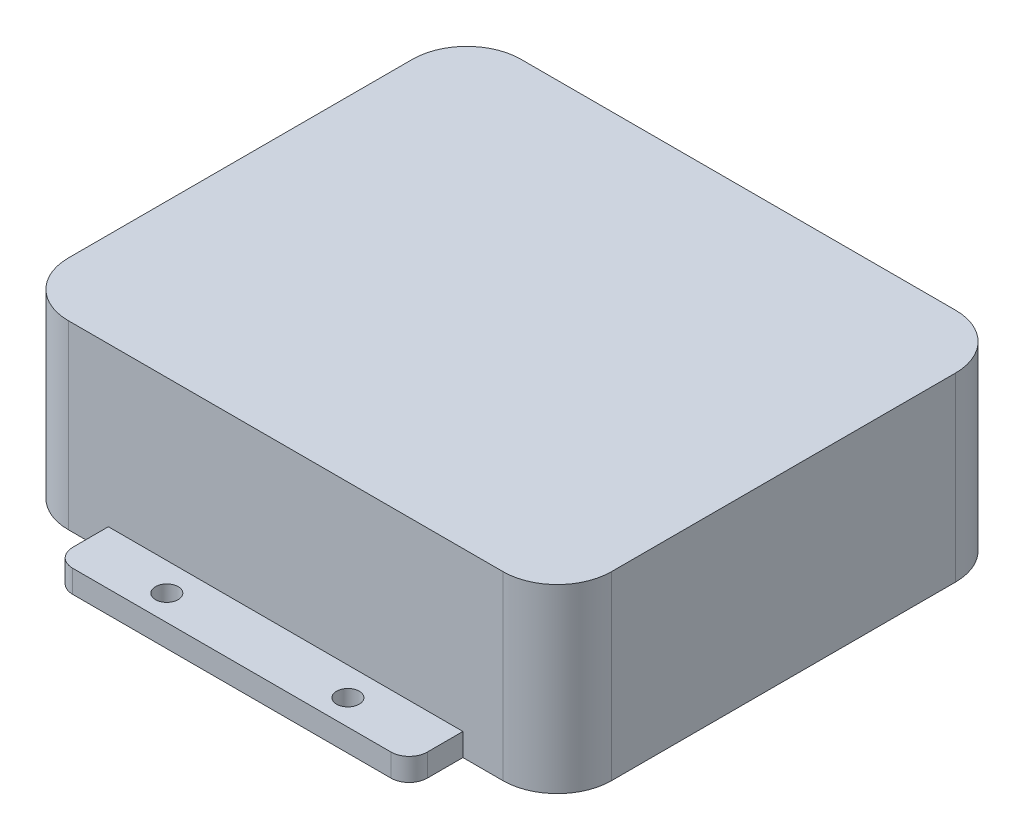
ISO-10303-21;
HEADER;
FILE_DESCRIPTION(('STEP AP214'),'2;1');
FILE_NAME('part.step','',(''),(''),'','','');
FILE_SCHEMA(('AUTOMOTIVE_DESIGN { 1 0 10303 214 1 1 1 1 }'));
ENDSEC;
DATA;
#1=APPLICATION_CONTEXT('core data for automotive mechanical design processes');
#2=APPLICATION_PROTOCOL_DEFINITION('international standard','automotive_design',2000,#1);
#3=PRODUCT_CONTEXT('',#1,'mechanical');
#4=PRODUCT('Part','Part','',(#3));
#5=PRODUCT_RELATED_PRODUCT_CATEGORY('part','',(#4));
#6=PRODUCT_DEFINITION_FORMATION('','',#4);
#7=PRODUCT_DEFINITION_CONTEXT('part definition',#1,'design');
#8=PRODUCT_DEFINITION('design','',#6,#7);
#9=PRODUCT_DEFINITION_SHAPE('','',#8);
#10=(LENGTH_UNIT() NAMED_UNIT(*) SI_UNIT(.MILLI.,.METRE.));
#11=(NAMED_UNIT(*) PLANE_ANGLE_UNIT() SI_UNIT($,.RADIAN.));
#12=(NAMED_UNIT(*) SI_UNIT($,.STERADIAN.) SOLID_ANGLE_UNIT());
#13=UNCERTAINTY_MEASURE_WITH_UNIT(LENGTH_MEASURE(1.E-05),#10,'distance_accuracy_value','');
#14=(GEOMETRIC_REPRESENTATION_CONTEXT(3) GLOBAL_UNCERTAINTY_ASSIGNED_CONTEXT((#13)) GLOBAL_UNIT_ASSIGNED_CONTEXT((#10,
#11,#12)) REPRESENTATION_CONTEXT('',''));
#15=CARTESIAN_POINT('',(0.,0.,0.));
#16=DIRECTION('',(0.,0.,1.));
#17=DIRECTION('',(1.,0.,0.));
#18=AXIS2_PLACEMENT_3D('',#15,#16,#17);
#19=CARTESIAN_POINT('',(-30.4799999999999,25.4,-31.75));
#20=DIRECTION('',(0.,0.,-1.));
#21=DIRECTION('',(-1.,0.,0.));
#22=AXIS2_PLACEMENT_3D('',#19,#20,#21);
#23=PLANE('',#22);
#24=DIRECTION('',(1.,0.,0.));
#25=VECTOR('',#24,1.);
#26=CARTESIAN_POINT('',(-30.4799999999999,0.,-31.75));
#27=LINE('',#26,#25);
#28=CARTESIAN_POINT('',(24.8694908342602,0.,-31.75));
#29=VERTEX_POINT('',#28);
#30=CARTESIAN_POINT('',(30.48,0.,-31.75));
#31=VERTEX_POINT('',#30);
#32=EDGE_CURVE('E193',#29,#31,#27,.T.);
#33=ORIENTED_EDGE('',*,*,#32,.F.);
#34=DIRECTION('',(0.,-1.,0.));
#35=VECTOR('',#34,1.);
#36=CARTESIAN_POINT('',(24.8694908342602,3.175,-31.75));
#37=LINE('',#36,#35);
#38=CARTESIAN_POINT('',(24.8694908342602,3.175,-31.75));
#39=VERTEX_POINT('',#38);
#40=EDGE_CURVE('E51',#39,#29,#37,.T.);
#41=ORIENTED_EDGE('',*,*,#40,.F.);
#42=DIRECTION('',(1.,0.,0.));
#43=VECTOR('',#42,1.);
#44=CARTESIAN_POINT('',(-24.8694908342602,3.175,-31.75));
#45=LINE('',#44,#43);
#46=CARTESIAN_POINT('',(-24.8694908342602,3.175,-31.75));
#47=VERTEX_POINT('',#46);
#48=EDGE_CURVE('E179',#47,#39,#45,.T.);
#49=ORIENTED_EDGE('',*,*,#48,.F.);
#50=DIRECTION('',(0.,-1.,0.));
#51=VECTOR('',#50,1.);
#52=CARTESIAN_POINT('',(-24.8694908342602,3.175,-31.75));
#53=LINE('',#52,#51);
#54=CARTESIAN_POINT('',(-24.8694908342602,0.,-31.75));
#55=VERTEX_POINT('',#54);
#56=EDGE_CURVE('E338',#47,#55,#53,.T.);
#57=ORIENTED_EDGE('',*,*,#56,.T.);
#58=CARTESIAN_POINT('',(-30.4799999999999,0.,-31.75));
#59=VERTEX_POINT('',#58);
#60=EDGE_CURVE('E281',#59,#55,#27,.T.);
#61=ORIENTED_EDGE('',*,*,#60,.F.);
#62=DIRECTION('',(0.,-1.,0.));
#63=VECTOR('',#62,1.);
#64=CARTESIAN_POINT('',(-30.4799999999999,25.4,-31.75));
#65=LINE('',#64,#63);
#66=CARTESIAN_POINT('',(-30.4799999999999,25.4,-31.75));
#67=VERTEX_POINT('',#66);
#68=EDGE_CURVE('E308',#67,#59,#65,.T.);
#69=ORIENTED_EDGE('',*,*,#68,.F.);
#70=DIRECTION('',(1.,0.,0.));
#71=VECTOR('',#70,1.);
#72=CARTESIAN_POINT('',(-30.4799999999999,25.4,-31.75));
#73=LINE('',#72,#71);
#74=CARTESIAN_POINT('',(30.48,25.4,-31.75));
#75=VERTEX_POINT('',#74);
#76=EDGE_CURVE('E259',#67,#75,#73,.T.);
#77=ORIENTED_EDGE('',*,*,#76,.T.);
#78=DIRECTION('',(0.,-1.,0.));
#79=VECTOR('',#78,1.);
#80=CARTESIAN_POINT('',(30.48,25.4,-31.75));
#81=LINE('',#80,#79);
#82=EDGE_CURVE('E44',#75,#31,#81,.T.);
#83=ORIENTED_EDGE('',*,*,#82,.T.);
#84=EDGE_LOOP('',(#33,#41,#49,#57,#61,#69,#77,#83));
#85=FACE_BOUND('',#84,.T.);
#86=ADVANCED_FACE('F36',(#85),#23,.T.);
#87=CARTESIAN_POINT('',(-30.4799999999999,25.4,31.75));
#88=DIRECTION('',(0.,0.,-1.));
#89=DIRECTION('',(-1.,0.,0.));
#90=AXIS2_PLACEMENT_3D('',#87,#88,#89);
#91=PLANE('',#90);
#92=DIRECTION('',(0.,-1.,0.));
#93=VECTOR('',#92,1.);
#94=CARTESIAN_POINT('',(24.8694908342602,3.175,31.75));
#95=LINE('',#94,#93);
#96=CARTESIAN_POINT('',(24.8694908342602,3.175,31.75));
#97=VERTEX_POINT('',#96);
#98=CARTESIAN_POINT('',(24.8694908342602,0.,31.75));
#99=VERTEX_POINT('',#98);
#100=EDGE_CURVE('E247',#97,#99,#95,.T.);
#101=ORIENTED_EDGE('',*,*,#100,.T.);
#102=DIRECTION('',(1.,0.,0.));
#103=VECTOR('',#102,1.);
#104=CARTESIAN_POINT('',(-30.4799999999999,0.,31.75));
#105=LINE('',#104,#103);
#106=CARTESIAN_POINT('',(30.48,0.,31.75));
#107=VERTEX_POINT('',#106);
#108=EDGE_CURVE('E293',#99,#107,#105,.T.);
#109=ORIENTED_EDGE('',*,*,#108,.T.);
#110=DIRECTION('',(0.,-1.,0.));
#111=VECTOR('',#110,1.);
#112=CARTESIAN_POINT('',(30.48,25.4,31.75));
#113=LINE('',#112,#111);
#114=CARTESIAN_POINT('',(30.48,25.4,31.75));
#115=VERTEX_POINT('',#114);
#116=EDGE_CURVE('E299',#115,#107,#113,.T.);
#117=ORIENTED_EDGE('',*,*,#116,.F.);
#118=DIRECTION('',(1.,0.,0.));
#119=VECTOR('',#118,1.);
#120=CARTESIAN_POINT('',(-30.4799999999999,25.4,31.75));
#121=LINE('',#120,#119);
#122=CARTESIAN_POINT('',(-30.4799999999999,25.4,31.75));
#123=VERTEX_POINT('',#122);
#124=EDGE_CURVE('E271',#123,#115,#121,.T.);
#125=ORIENTED_EDGE('',*,*,#124,.F.);
#126=DIRECTION('',(0.,-1.,0.));
#127=VECTOR('',#126,1.);
#128=CARTESIAN_POINT('',(-30.4799999999999,25.4,31.75));
#129=LINE('',#128,#127);
#130=CARTESIAN_POINT('',(-30.4799999999999,0.,31.75));
#131=VERTEX_POINT('',#130);
#132=EDGE_CURVE('E302',#123,#131,#129,.T.);
#133=ORIENTED_EDGE('',*,*,#132,.T.);
#134=CARTESIAN_POINT('',(-24.8694908342602,0.,31.75));
#135=VERTEX_POINT('',#134);
#136=EDGE_CURVE('E294',#131,#135,#105,.T.);
#137=ORIENTED_EDGE('',*,*,#136,.T.);
#138=DIRECTION('',(0.,-1.,0.));
#139=VECTOR('',#138,1.);
#140=CARTESIAN_POINT('',(-24.8694908342602,3.175,31.75));
#141=LINE('',#140,#139);
#142=CARTESIAN_POINT('',(-24.8694908342602,3.175,31.75));
#143=VERTEX_POINT('',#142);
#144=EDGE_CURVE('E244',#143,#135,#141,.T.);
#145=ORIENTED_EDGE('',*,*,#144,.F.);
#146=DIRECTION('',(-1.,0.,0.));
#147=VECTOR('',#146,1.);
#148=CARTESIAN_POINT('',(-24.8694908342602,3.175,31.75));
#149=LINE('',#148,#147);
#150=EDGE_CURVE('E59',#97,#143,#149,.T.);
#151=ORIENTED_EDGE('',*,*,#150,.F.);
#152=EDGE_LOOP('',(#101,#109,#117,#125,#133,#137,#145,#151));
#153=FACE_BOUND('',#152,.T.);
#154=ADVANCED_FACE('F393',(#153),#91,.F.);
#155=CARTESIAN_POINT('',(38.1,25.4,24.1299999999999));
#156=DIRECTION('',(-1.,0.,0.));
#157=DIRECTION('',(0.,0.,1.));
#158=AXIS2_PLACEMENT_3D('',#155,#156,#157);
#159=PLANE('',#158);
#160=DIRECTION('',(0.,0.,-1.));
#161=VECTOR('',#160,1.);
#162=CARTESIAN_POINT('',(38.1,0.,24.1299999999999));
#163=LINE('',#162,#161);
#164=CARTESIAN_POINT('',(38.1,0.,24.1299999999999));
#165=VERTEX_POINT('',#164);
#166=CARTESIAN_POINT('',(38.1,0.,-24.1299999999999));
#167=VERTEX_POINT('',#166);
#168=EDGE_CURVE('E252',#165,#167,#163,.T.);
#169=ORIENTED_EDGE('',*,*,#168,.T.);
#170=DIRECTION('',(0.,-1.,0.));
#171=VECTOR('',#170,1.);
#172=CARTESIAN_POINT('',(38.1,25.4,-24.1299999999999));
#173=LINE('',#172,#171);
#174=CARTESIAN_POINT('',(38.1,25.4,-24.1299999999999));
#175=VERTEX_POINT('',#174);
#176=EDGE_CURVE('E11',#175,#167,#173,.T.);
#177=ORIENTED_EDGE('',*,*,#176,.F.);
#178=DIRECTION('',(0.,0.,-1.));
#179=VECTOR('',#178,1.);
#180=CARTESIAN_POINT('',(38.1,25.4,24.1299999999999));
#181=LINE('',#180,#179);
#182=CARTESIAN_POINT('',(38.1,25.4,24.1299999999999));
#183=VERTEX_POINT('',#182);
#184=EDGE_CURVE('E253',#183,#175,#181,.T.);
#185=ORIENTED_EDGE('',*,*,#184,.F.);
#186=DIRECTION('',(0.,-1.,0.));
#187=VECTOR('',#186,1.);
#188=CARTESIAN_POINT('',(38.1,25.4,24.1299999999999));
#189=LINE('',#188,#187);
#190=EDGE_CURVE('E275',#183,#165,#189,.T.);
#191=ORIENTED_EDGE('',*,*,#190,.T.);
#192=EDGE_LOOP('',(#169,#177,#185,#191));
#193=FACE_BOUND('',#192,.T.);
#194=ADVANCED_FACE('F38',(#193),#159,.F.);
#195=CARTESIAN_POINT('',(30.48,25.4,-24.13));
#196=DIRECTION('',(0.,-1.,0.));
#197=DIRECTION('',(0.,0.,-1.));
#198=AXIS2_PLACEMENT_3D('',#195,#196,#197);
#199=CYLINDRICAL_SURFACE('',#198,7.62);
#200=CARTESIAN_POINT('',(30.48,0.,-24.13));
#201=DIRECTION('',(0.,-1.,0.));
#202=DIRECTION('',(0.,0.,-1.));
#203=AXIS2_PLACEMENT_3D('',#200,#201,#202);
#204=CIRCLE('',#203,7.62);
#205=EDGE_CURVE('E278',#31,#167,#204,.T.);
#206=ORIENTED_EDGE('',*,*,#205,.F.);
#207=ORIENTED_EDGE('',*,*,#82,.F.);
#208=CARTESIAN_POINT('',(30.48,25.4,-24.13));
#209=DIRECTION('',(0.,-1.,0.));
#210=DIRECTION('',(0.,0.,-1.));
#211=AXIS2_PLACEMENT_3D('',#208,#209,#210);
#212=CIRCLE('',#211,7.62);
#213=EDGE_CURVE('E255',#75,#175,#212,.T.);
#214=ORIENTED_EDGE('',*,*,#213,.T.);
#215=ORIENTED_EDGE('',*,*,#176,.T.);
#216=EDGE_LOOP('',(#206,#207,#214,#215));
#217=FACE_BOUND('',#216,.T.);
#218=ADVANCED_FACE('F313',(#217),#199,.T.);
#219=CARTESIAN_POINT('',(-30.48,25.4,-24.13));
#220=DIRECTION('',(0.,-1.,0.));
#221=DIRECTION('',(0.,0.,-1.));
#222=AXIS2_PLACEMENT_3D('',#219,#220,#221);
#223=CYLINDRICAL_SURFACE('',#222,7.62);
#224=CARTESIAN_POINT('',(-30.48,0.,-24.13));
#225=DIRECTION('',(0.,-1.,0.));
#226=DIRECTION('',(0.,0.,-1.));
#227=AXIS2_PLACEMENT_3D('',#224,#225,#226);
#228=CIRCLE('',#227,7.62);
#229=CARTESIAN_POINT('',(-38.1,0.,-24.1299999999999));
#230=VERTEX_POINT('',#229);
#231=EDGE_CURVE('E284',#230,#59,#228,.T.);
#232=ORIENTED_EDGE('',*,*,#231,.F.);
#233=DIRECTION('',(0.,-1.,0.));
#234=VECTOR('',#233,1.);
#235=CARTESIAN_POINT('',(-38.1,25.4,-24.1299999999999));
#236=LINE('',#235,#234);
#237=CARTESIAN_POINT('',(-38.1,25.4,-24.1299999999999));
#238=VERTEX_POINT('',#237);
#239=EDGE_CURVE('E306',#238,#230,#236,.T.);
#240=ORIENTED_EDGE('',*,*,#239,.F.);
#241=CARTESIAN_POINT('',(-30.48,25.4,-24.13));
#242=DIRECTION('',(0.,-1.,0.));
#243=DIRECTION('',(0.,0.,-1.));
#244=AXIS2_PLACEMENT_3D('',#241,#242,#243);
#245=CIRCLE('',#244,7.62);
#246=EDGE_CURVE('E262',#238,#67,#245,.T.);
#247=ORIENTED_EDGE('',*,*,#246,.T.);
#248=ORIENTED_EDGE('',*,*,#68,.T.);
#249=EDGE_LOOP('',(#232,#240,#247,#248));
#250=FACE_BOUND('',#249,.T.);
#251=ADVANCED_FACE('F400',(#250),#223,.T.);
#252=CARTESIAN_POINT('',(-38.1,25.4,24.1299999999999));
#253=DIRECTION('',(-1.,0.,0.));
#254=DIRECTION('',(0.,0.,1.));
#255=AXIS2_PLACEMENT_3D('',#252,#253,#254);
#256=PLANE('',#255);
#257=DIRECTION('',(0.,0.,-1.));
#258=VECTOR('',#257,1.);
#259=CARTESIAN_POINT('',(-38.1,0.,24.1299999999999));
#260=LINE('',#259,#258);
#261=CARTESIAN_POINT('',(-38.1,0.,24.1299999999999));
#262=VERTEX_POINT('',#261);
#263=EDGE_CURVE('E287',#262,#230,#260,.T.);
#264=ORIENTED_EDGE('',*,*,#263,.F.);
#265=DIRECTION('',(0.,-1.,0.));
#266=VECTOR('',#265,1.);
#267=CARTESIAN_POINT('',(-38.1,25.4,24.1299999999999));
#268=LINE('',#267,#266);
#269=CARTESIAN_POINT('',(-38.1,25.4,24.1299999999999));
#270=VERTEX_POINT('',#269);
#271=EDGE_CURVE('E304',#270,#262,#268,.T.);
#272=ORIENTED_EDGE('',*,*,#271,.F.);
#273=DIRECTION('',(0.,0.,-1.));
#274=VECTOR('',#273,1.);
#275=CARTESIAN_POINT('',(-38.1,25.4,24.1299999999999));
#276=LINE('',#275,#274);
#277=EDGE_CURVE('E265',#270,#238,#276,.T.);
#278=ORIENTED_EDGE('',*,*,#277,.T.);
#279=ORIENTED_EDGE('',*,*,#239,.T.);
#280=EDGE_LOOP('',(#264,#272,#278,#279));
#281=FACE_BOUND('',#280,.T.);
#282=ADVANCED_FACE('F407',(#281),#256,.T.);
#283=CARTESIAN_POINT('',(-30.48,25.4,24.13));
#284=DIRECTION('',(0.,-1.,0.));
#285=DIRECTION('',(0.,0.,-1.));
#286=AXIS2_PLACEMENT_3D('',#283,#284,#285);
#287=CYLINDRICAL_SURFACE('',#286,7.62);
#288=CARTESIAN_POINT('',(-30.48,0.,24.13));
#289=DIRECTION('',(0.,-1.,0.));
#290=DIRECTION('',(0.,0.,-1.));
#291=AXIS2_PLACEMENT_3D('',#288,#289,#290);
#292=CIRCLE('',#291,7.62);
#293=EDGE_CURVE('E290',#131,#262,#292,.T.);
#294=ORIENTED_EDGE('',*,*,#293,.F.);
#295=ORIENTED_EDGE('',*,*,#132,.F.);
#296=CARTESIAN_POINT('',(-30.48,25.4,24.13));
#297=DIRECTION('',(0.,-1.,0.));
#298=DIRECTION('',(0.,0.,-1.));
#299=AXIS2_PLACEMENT_3D('',#296,#297,#298);
#300=CIRCLE('',#299,7.62);
#301=EDGE_CURVE('E268',#123,#270,#300,.T.);
#302=ORIENTED_EDGE('',*,*,#301,.T.);
#303=ORIENTED_EDGE('',*,*,#271,.T.);
#304=EDGE_LOOP('',(#294,#295,#302,#303));
#305=FACE_BOUND('',#304,.T.);
#306=ADVANCED_FACE('F444',(#305),#287,.T.);
#307=CARTESIAN_POINT('',(30.48,25.4,24.13));
#308=DIRECTION('',(0.,-1.,0.));
#309=DIRECTION('',(0.,0.,-1.));
#310=AXIS2_PLACEMENT_3D('',#307,#308,#309);
#311=CYLINDRICAL_SURFACE('',#310,7.62);
#312=CARTESIAN_POINT('',(30.48,0.,24.13));
#313=DIRECTION('',(0.,1.,0.));
#314=DIRECTION('',(0.,0.,1.));
#315=AXIS2_PLACEMENT_3D('',#312,#313,#314);
#316=CIRCLE('',#315,7.62);
#317=EDGE_CURVE('E256',#107,#165,#316,.T.);
#318=ORIENTED_EDGE('',*,*,#317,.T.);
#319=ORIENTED_EDGE('',*,*,#190,.F.);
#320=CARTESIAN_POINT('',(30.48,25.4,24.13));
#321=DIRECTION('',(0.,1.,0.));
#322=DIRECTION('',(0.,0.,1.));
#323=AXIS2_PLACEMENT_3D('',#320,#321,#322);
#324=CIRCLE('',#323,7.62);
#325=EDGE_CURVE('E273',#115,#183,#324,.T.);
#326=ORIENTED_EDGE('',*,*,#325,.F.);
#327=ORIENTED_EDGE('',*,*,#116,.T.);
#328=EDGE_LOOP('',(#318,#319,#326,#327));
#329=FACE_BOUND('',#328,.T.);
#330=ADVANCED_FACE('F416',(#329),#311,.T.);
#331=CARTESIAN_POINT('',(30.48,25.4,-24.13));
#332=DIRECTION('',(0.,-1.,0.));
#333=DIRECTION('',(0.,0.,-1.));
#334=AXIS2_PLACEMENT_3D('',#331,#332,#333);
#335=PLANE('',#334);
#336=ORIENTED_EDGE('',*,*,#184,.T.);
#337=ORIENTED_EDGE('',*,*,#213,.F.);
#338=ORIENTED_EDGE('',*,*,#76,.F.);
#339=ORIENTED_EDGE('',*,*,#246,.F.);
#340=ORIENTED_EDGE('',*,*,#277,.F.);
#341=ORIENTED_EDGE('',*,*,#301,.F.);
#342=ORIENTED_EDGE('',*,*,#124,.T.);
#343=ORIENTED_EDGE('',*,*,#325,.T.);
#344=EDGE_LOOP('',(#336,#337,#338,#339,#340,#341,#342,#343));
#345=FACE_BOUND('',#344,.T.);
#346=ADVANCED_FACE('F454',(#345),#335,.F.);
#347=CARTESIAN_POINT('',(30.48,0.,-24.13));
#348=DIRECTION('',(0.,-1.,0.));
#349=DIRECTION('',(0.,0.,-1.));
#350=AXIS2_PLACEMENT_3D('',#347,#348,#349);
#351=PLANE('',#350);
#352=ORIENTED_EDGE('',*,*,#168,.F.);
#353=ORIENTED_EDGE('',*,*,#317,.F.);
#354=ORIENTED_EDGE('',*,*,#108,.F.);
#355=DIRECTION('',(0.,0.,-1.));
#356=VECTOR('',#355,1.);
#357=CARTESIAN_POINT('',(24.8694908342602,0.,31.75));
#358=LINE('',#357,#356);
#359=CARTESIAN_POINT('',(24.8694908342602,0.,36.7549116127372));
#360=VERTEX_POINT('',#359);
#361=EDGE_CURVE('E228',#360,#99,#358,.T.);
#362=ORIENTED_EDGE('',*,*,#361,.F.);
#363=CARTESIAN_POINT('',(22.3294908342602,0.,36.7549116127372));
#364=DIRECTION('',(0.,1.,0.));
#365=DIRECTION('',(0.,0.,-1.));
#366=AXIS2_PLACEMENT_3D('',#363,#364,#365);
#367=CIRCLE('',#366,2.54);
#368=CARTESIAN_POINT('',(22.3294908342602,0.,39.2949116127372));
#369=VERTEX_POINT('',#368);
#370=EDGE_CURVE('E209',#369,#360,#367,.T.);
#371=ORIENTED_EDGE('',*,*,#370,.F.);
#372=DIRECTION('',(1.,0.,0.));
#373=VECTOR('',#372,1.);
#374=CARTESIAN_POINT('',(-22.3294908342602,0.,39.2949116127372));
#375=LINE('',#374,#373);
#376=CARTESIAN_POINT('',(-22.3294908342602,0.,39.2949116127372));
#377=VERTEX_POINT('',#376);
#378=EDGE_CURVE('E216',#377,#369,#375,.T.);
#379=ORIENTED_EDGE('',*,*,#378,.F.);
#380=CARTESIAN_POINT('',(-22.3294908342602,0.,36.7549116127372));
#381=DIRECTION('',(0.,1.,0.));
#382=DIRECTION('',(0.,0.,-1.));
#383=AXIS2_PLACEMENT_3D('',#380,#381,#382);
#384=CIRCLE('',#383,2.54);
#385=CARTESIAN_POINT('',(-24.8694908342602,0.,36.7549116127372));
#386=VERTEX_POINT('',#385);
#387=EDGE_CURVE('E233',#386,#377,#384,.T.);
#388=ORIENTED_EDGE('',*,*,#387,.F.);
#389=DIRECTION('',(0.,0.,1.));
#390=VECTOR('',#389,1.);
#391=CARTESIAN_POINT('',(-24.8694908342602,0.,31.75));
#392=LINE('',#391,#390);
#393=EDGE_CURVE('E231',#135,#386,#392,.T.);
#394=ORIENTED_EDGE('',*,*,#393,.F.);
#395=ORIENTED_EDGE('',*,*,#136,.F.);
#396=ORIENTED_EDGE('',*,*,#293,.T.);
#397=ORIENTED_EDGE('',*,*,#263,.T.);
#398=ORIENTED_EDGE('',*,*,#231,.T.);
#399=ORIENTED_EDGE('',*,*,#60,.T.);
#400=DIRECTION('',(0.,0.,1.));
#401=VECTOR('',#400,1.);
#402=CARTESIAN_POINT('',(-24.8694908342602,0.,-31.75));
#403=LINE('',#402,#401);
#404=CARTESIAN_POINT('',(-24.8694908342602,0.,-36.7549116127372));
#405=VERTEX_POINT('',#404);
#406=EDGE_CURVE('E189',#405,#55,#403,.T.);
#407=ORIENTED_EDGE('',*,*,#406,.F.);
#408=CARTESIAN_POINT('',(-22.3294908342602,0.,-36.7549116127372));
#409=DIRECTION('',(0.,1.,0.));
#410=DIRECTION('',(0.,0.,1.));
#411=AXIS2_PLACEMENT_3D('',#408,#409,#410);
#412=CIRCLE('',#411,2.54);
#413=CARTESIAN_POINT('',(-22.3294908342602,0.,-39.2949116127372));
#414=VERTEX_POINT('',#413);
#415=EDGE_CURVE('E335',#414,#405,#412,.T.);
#416=ORIENTED_EDGE('',*,*,#415,.F.);
#417=DIRECTION('',(-1.,0.,0.));
#418=VECTOR('',#417,1.);
#419=CARTESIAN_POINT('',(-22.3294908342602,0.,-39.2949116127372));
#420=LINE('',#419,#418);
#421=CARTESIAN_POINT('',(22.3294908342602,0.,-39.2949116127372));
#422=VERTEX_POINT('',#421);
#423=EDGE_CURVE('E326',#422,#414,#420,.T.);
#424=ORIENTED_EDGE('',*,*,#423,.F.);
#425=CARTESIAN_POINT('',(22.3294908342602,0.,-36.7549116127372));
#426=DIRECTION('',(0.,1.,0.));
#427=DIRECTION('',(0.,0.,1.));
#428=AXIS2_PLACEMENT_3D('',#425,#426,#427);
#429=CIRCLE('',#428,2.54);
#430=CARTESIAN_POINT('',(24.8694908342602,0.,-36.7549116127372));
#431=VERTEX_POINT('',#430);
#432=EDGE_CURVE('E323',#431,#422,#429,.T.);
#433=ORIENTED_EDGE('',*,*,#432,.F.);
#434=DIRECTION('',(0.,0.,-1.));
#435=VECTOR('',#434,1.);
#436=CARTESIAN_POINT('',(24.8694908342602,0.,-31.75));
#437=LINE('',#436,#435);
#438=EDGE_CURVE('E321',#29,#431,#437,.T.);
#439=ORIENTED_EDGE('',*,*,#438,.F.);
#440=ORIENTED_EDGE('',*,*,#32,.T.);
#441=ORIENTED_EDGE('',*,*,#205,.T.);
#442=EDGE_LOOP('',(#352,#353,#354,#362,#371,#379,#388,#394,#395,#396,#397,#398,#399,#407,#416,
#424,#433,#439,#440,#441));
#443=FACE_BOUND('',#442,.T.);
#444=CARTESIAN_POINT('',(12.7,0.,35.71875));
#445=DIRECTION('',(0.,1.,0.));
#446=DIRECTION('',(0.,0.,1.));
#447=AXIS2_PLACEMENT_3D('',#444,#445,#446);
#448=CIRCLE('',#447,1.5875);
#449=CARTESIAN_POINT('',(12.7,0.,37.30625));
#450=VERTEX_POINT('',#449);
#451=EDGE_CURVE('E204',#450,#450,#448,.T.);
#452=ORIENTED_EDGE('',*,*,#451,.T.);
#453=EDGE_LOOP('',(#452));
#454=FACE_BOUND('',#453,.T.);
#455=CARTESIAN_POINT('',(-12.7,0.,35.71875));
#456=DIRECTION('',(0.,1.,0.));
#457=DIRECTION('',(0.,0.,-1.));
#458=AXIS2_PLACEMENT_3D('',#455,#456,#457);
#459=CIRCLE('',#458,1.5875);
#460=CARTESIAN_POINT('',(-12.7,0.,34.13125));
#461=VERTEX_POINT('',#460);
#462=EDGE_CURVE('E194',#461,#461,#459,.T.);
#463=ORIENTED_EDGE('',*,*,#462,.T.);
#464=EDGE_LOOP('',(#463));
#465=FACE_BOUND('',#464,.T.);
#466=CARTESIAN_POINT('',(12.7,0.,-35.71875));
#467=DIRECTION('',(0.,1.,0.));
#468=DIRECTION('',(0.,0.,-1.));
#469=AXIS2_PLACEMENT_3D('',#466,#467,#468);
#470=CIRCLE('',#469,1.5875);
#471=CARTESIAN_POINT('',(12.7,0.,-37.30625));
#472=VERTEX_POINT('',#471);
#473=EDGE_CURVE('E329',#472,#472,#470,.T.);
#474=ORIENTED_EDGE('',*,*,#473,.T.);
#475=EDGE_LOOP('',(#474));
#476=FACE_BOUND('',#475,.T.);
#477=CARTESIAN_POINT('',(-12.7,0.,-35.71875));
#478=DIRECTION('',(0.,1.,0.));
#479=DIRECTION('',(0.,0.,1.));
#480=AXIS2_PLACEMENT_3D('',#477,#478,#479);
#481=CIRCLE('',#480,1.5875);
#482=CARTESIAN_POINT('',(-12.7,0.,-34.13125));
#483=VERTEX_POINT('',#482);
#484=EDGE_CURVE('E368',#483,#483,#481,.T.);
#485=ORIENTED_EDGE('',*,*,#484,.T.);
#486=EDGE_LOOP('',(#485));
#487=FACE_BOUND('',#486,.T.);
#488=ADVANCED_FACE('F317',(#443,#454,#465,#476,#487),#351,.T.);
#489=CARTESIAN_POINT('',(22.3294908342602,3.175,36.7549116127372));
#490=DIRECTION('',(0.,-1.,0.));
#491=DIRECTION('',(0.,0.,-1.));
#492=AXIS2_PLACEMENT_3D('',#489,#490,#491);
#493=PLANE('',#492);
#494=CARTESIAN_POINT('',(22.3294908342602,3.175,36.7549116127372));
#495=DIRECTION('',(0.,1.,0.));
#496=DIRECTION('',(0.,0.,-1.));
#497=AXIS2_PLACEMENT_3D('',#494,#495,#496);
#498=CIRCLE('',#497,2.54);
#499=CARTESIAN_POINT('',(22.3294908342602,3.175,39.2949116127372));
#500=VERTEX_POINT('',#499);
#501=CARTESIAN_POINT('',(24.8694908342602,3.175,36.7549116127372));
#502=VERTEX_POINT('',#501);
#503=EDGE_CURVE('E212',#500,#502,#498,.T.);
#504=ORIENTED_EDGE('',*,*,#503,.T.);
#505=DIRECTION('',(0.,0.,-1.));
#506=VECTOR('',#505,1.);
#507=CARTESIAN_POINT('',(24.8694908342602,3.175,31.75));
#508=LINE('',#507,#506);
#509=EDGE_CURVE('E215',#502,#97,#508,.T.);
#510=ORIENTED_EDGE('',*,*,#509,.T.);
#511=ORIENTED_EDGE('',*,*,#150,.T.);
#512=DIRECTION('',(0.,0.,1.));
#513=VECTOR('',#512,1.);
#514=CARTESIAN_POINT('',(-24.8694908342602,3.175,31.75));
#515=LINE('',#514,#513);
#516=CARTESIAN_POINT('',(-24.8694908342602,3.175,36.7549116127372));
#517=VERTEX_POINT('',#516);
#518=EDGE_CURVE('E219',#143,#517,#515,.T.);
#519=ORIENTED_EDGE('',*,*,#518,.T.);
#520=CARTESIAN_POINT('',(-22.3294908342602,3.175,36.7549116127372));
#521=DIRECTION('',(0.,1.,0.));
#522=DIRECTION('',(0.,0.,-1.));
#523=AXIS2_PLACEMENT_3D('',#520,#521,#522);
#524=CIRCLE('',#523,2.54);
#525=CARTESIAN_POINT('',(-22.3294908342602,3.175,39.2949116127372));
#526=VERTEX_POINT('',#525);
#527=EDGE_CURVE('E221',#517,#526,#524,.T.);
#528=ORIENTED_EDGE('',*,*,#527,.T.);
#529=DIRECTION('',(1.,0.,0.));
#530=VECTOR('',#529,1.);
#531=CARTESIAN_POINT('',(-22.3294908342602,3.175,39.2949116127372));
#532=LINE('',#531,#530);
#533=EDGE_CURVE('E223',#526,#500,#532,.T.);
#534=ORIENTED_EDGE('',*,*,#533,.T.);
#535=EDGE_LOOP('',(#504,#510,#511,#519,#528,#534));
#536=FACE_BOUND('',#535,.T.);
#537=CARTESIAN_POINT('',(12.7,3.175,35.71875));
#538=DIRECTION('',(0.,1.,0.));
#539=DIRECTION('',(0.,0.,1.));
#540=AXIS2_PLACEMENT_3D('',#537,#538,#539);
#541=CIRCLE('',#540,1.5875);
#542=CARTESIAN_POINT('',(12.7,3.175,37.30625));
#543=VERTEX_POINT('',#542);
#544=EDGE_CURVE('E206',#543,#543,#541,.T.);
#545=ORIENTED_EDGE('',*,*,#544,.F.);
#546=EDGE_LOOP('',(#545));
#547=FACE_BOUND('',#546,.T.);
#548=CARTESIAN_POINT('',(-12.7,3.175,35.71875));
#549=DIRECTION('',(0.,1.,0.));
#550=DIRECTION('',(0.,0.,-1.));
#551=AXIS2_PLACEMENT_3D('',#548,#549,#550);
#552=CIRCLE('',#551,1.5875);
#553=CARTESIAN_POINT('',(-12.7,3.175,34.13125));
#554=VERTEX_POINT('',#553);
#555=EDGE_CURVE('E197',#554,#554,#552,.T.);
#556=ORIENTED_EDGE('',*,*,#555,.F.);
#557=EDGE_LOOP('',(#556));
#558=FACE_BOUND('',#557,.T.);
#559=ADVANCED_FACE('F461',(#536,#547,#558),#493,.F.);
#560=CARTESIAN_POINT('',(22.3294908342602,3.175,36.7549116127372));
#561=DIRECTION('',(0.,-1.,0.));
#562=DIRECTION('',(0.,0.,-1.));
#563=AXIS2_PLACEMENT_3D('',#560,#561,#562);
#564=CYLINDRICAL_SURFACE('',#563,2.54);
#565=ORIENTED_EDGE('',*,*,#370,.T.);
#566=DIRECTION('',(0.,-1.,0.));
#567=VECTOR('',#566,1.);
#568=CARTESIAN_POINT('',(24.8694908342602,3.175,36.7549116127372));
#569=LINE('',#568,#567);
#570=EDGE_CURVE('E249',#502,#360,#569,.T.);
#571=ORIENTED_EDGE('',*,*,#570,.F.);
#572=ORIENTED_EDGE('',*,*,#503,.F.);
#573=DIRECTION('',(0.,-1.,0.));
#574=VECTOR('',#573,1.);
#575=CARTESIAN_POINT('',(22.3294908342602,3.175,39.2949116127372));
#576=LINE('',#575,#574);
#577=EDGE_CURVE('E225',#500,#369,#576,.T.);
#578=ORIENTED_EDGE('',*,*,#577,.T.);
#579=EDGE_LOOP('',(#565,#571,#572,#578));
#580=FACE_BOUND('',#579,.T.);
#581=ADVANCED_FACE('F425',(#580),#564,.T.);
#582=CARTESIAN_POINT('',(24.8694908342602,3.175,31.75));
#583=DIRECTION('',(-1.,0.,0.));
#584=DIRECTION('',(0.,0.,1.));
#585=AXIS2_PLACEMENT_3D('',#582,#583,#584);
#586=PLANE('',#585);
#587=ORIENTED_EDGE('',*,*,#361,.T.);
#588=ORIENTED_EDGE('',*,*,#100,.F.);
#589=ORIENTED_EDGE('',*,*,#509,.F.);
#590=ORIENTED_EDGE('',*,*,#570,.T.);
#591=EDGE_LOOP('',(#587,#588,#589,#590));
#592=FACE_BOUND('',#591,.T.);
#593=ADVANCED_FACE('F421',(#592),#586,.F.);
#594=CARTESIAN_POINT('',(-24.8694908342602,3.175,31.75));
#595=DIRECTION('',(1.,0.,0.));
#596=DIRECTION('',(0.,0.,-1.));
#597=AXIS2_PLACEMENT_3D('',#594,#595,#596);
#598=PLANE('',#597);
#599=ORIENTED_EDGE('',*,*,#393,.T.);
#600=DIRECTION('',(0.,-1.,0.));
#601=VECTOR('',#600,1.);
#602=CARTESIAN_POINT('',(-24.8694908342602,3.175,36.7549116127372));
#603=LINE('',#602,#601);
#604=EDGE_CURVE('E241',#517,#386,#603,.T.);
#605=ORIENTED_EDGE('',*,*,#604,.F.);
#606=ORIENTED_EDGE('',*,*,#518,.F.);
#607=ORIENTED_EDGE('',*,*,#144,.T.);
#608=EDGE_LOOP('',(#599,#605,#606,#607));
#609=FACE_BOUND('',#608,.T.);
#610=ADVANCED_FACE('F440',(#609),#598,.F.);
#611=CARTESIAN_POINT('',(-22.3294908342602,3.175,36.7549116127372));
#612=DIRECTION('',(0.,-1.,0.));
#613=DIRECTION('',(0.,0.,-1.));
#614=AXIS2_PLACEMENT_3D('',#611,#612,#613);
#615=CYLINDRICAL_SURFACE('',#614,2.54);
#616=ORIENTED_EDGE('',*,*,#387,.T.);
#617=DIRECTION('',(0.,-1.,0.));
#618=VECTOR('',#617,1.);
#619=CARTESIAN_POINT('',(-22.3294908342602,3.175,39.2949116127372));
#620=LINE('',#619,#618);
#621=EDGE_CURVE('E238',#526,#377,#620,.T.);
#622=ORIENTED_EDGE('',*,*,#621,.F.);
#623=ORIENTED_EDGE('',*,*,#527,.F.);
#624=ORIENTED_EDGE('',*,*,#604,.T.);
#625=EDGE_LOOP('',(#616,#622,#623,#624));
#626=FACE_BOUND('',#625,.T.);
#627=ADVANCED_FACE('F436',(#626),#615,.T.);
#628=CARTESIAN_POINT('',(-22.3294908342602,3.175,39.2949116127372));
#629=DIRECTION('',(0.,0.,-1.));
#630=DIRECTION('',(-1.,0.,0.));
#631=AXIS2_PLACEMENT_3D('',#628,#629,#630);
#632=PLANE('',#631);
#633=ORIENTED_EDGE('',*,*,#378,.T.);
#634=ORIENTED_EDGE('',*,*,#577,.F.);
#635=ORIENTED_EDGE('',*,*,#533,.F.);
#636=ORIENTED_EDGE('',*,*,#621,.T.);
#637=EDGE_LOOP('',(#633,#634,#635,#636));
#638=FACE_BOUND('',#637,.T.);
#639=ADVANCED_FACE('F431',(#638),#632,.F.);
#640=CARTESIAN_POINT('',(12.7,3.175,35.71875));
#641=DIRECTION('',(0.,-1.,0.));
#642=DIRECTION('',(0.,0.,-1.));
#643=AXIS2_PLACEMENT_3D('',#640,#641,#642);
#644=CYLINDRICAL_SURFACE('',#643,1.5875);
#645=ORIENTED_EDGE('',*,*,#544,.T.);
#646=EDGE_LOOP('',(#645));
#647=FACE_BOUND('',#646,.T.);
#648=ORIENTED_EDGE('',*,*,#451,.F.);
#649=EDGE_LOOP('',(#648));
#650=FACE_BOUND('',#649,.T.);
#651=ADVANCED_FACE('F386',(#647,#650),#644,.F.);
#652=CARTESIAN_POINT('',(-12.7,3.175,35.71875));
#653=DIRECTION('',(0.,-1.,0.));
#654=DIRECTION('',(0.,0.,-1.));
#655=AXIS2_PLACEMENT_3D('',#652,#653,#654);
#656=CYLINDRICAL_SURFACE('',#655,1.5875);
#657=ORIENTED_EDGE('',*,*,#555,.T.);
#658=EDGE_LOOP('',(#657));
#659=FACE_BOUND('',#658,.T.);
#660=ORIENTED_EDGE('',*,*,#462,.F.);
#661=EDGE_LOOP('',(#660));
#662=FACE_BOUND('',#661,.T.);
#663=ADVANCED_FACE('F377',(#659,#662),#656,.F.);
#664=CARTESIAN_POINT('',(22.3294908342602,3.175,-36.7549116127372));
#665=DIRECTION('',(0.,1.,0.));
#666=DIRECTION('',(0.,0.,1.));
#667=AXIS2_PLACEMENT_3D('',#664,#665,#666);
#668=PLANE('',#667);
#669=CARTESIAN_POINT('',(12.7,3.175,-35.71875));
#670=DIRECTION('',(0.,1.,0.));
#671=DIRECTION('',(0.,0.,-1.));
#672=AXIS2_PLACEMENT_3D('',#669,#670,#671);
#673=CIRCLE('',#672,1.5875);
#674=CARTESIAN_POINT('',(12.7,3.175,-37.30625));
#675=VERTEX_POINT('',#674);
#676=EDGE_CURVE('E324',#675,#675,#673,.T.);
#677=ORIENTED_EDGE('',*,*,#676,.F.);
#678=EDGE_LOOP('',(#677));
#679=FACE_BOUND('',#678,.T.);
#680=ORIENTED_EDGE('',*,*,#48,.T.);
#681=DIRECTION('',(0.,0.,-1.));
#682=VECTOR('',#681,1.);
#683=CARTESIAN_POINT('',(24.8694908342602,3.175,-31.75));
#684=LINE('',#683,#682);
#685=CARTESIAN_POINT('',(24.8694908342602,3.175,-36.7549116127372));
#686=VERTEX_POINT('',#685);
#687=EDGE_CURVE('E171',#39,#686,#684,.T.);
#688=ORIENTED_EDGE('',*,*,#687,.T.);
#689=CARTESIAN_POINT('',(22.3294908342602,3.175,-36.7549116127372));
#690=DIRECTION('',(0.,1.,0.));
#691=DIRECTION('',(0.,0.,1.));
#692=AXIS2_PLACEMENT_3D('',#689,#690,#691);
#693=CIRCLE('',#692,2.54);
#694=CARTESIAN_POINT('',(22.3294908342602,3.175,-39.2949116127372));
#695=VERTEX_POINT('',#694);
#696=EDGE_CURVE('E178',#686,#695,#693,.T.);
#697=ORIENTED_EDGE('',*,*,#696,.T.);
#698=DIRECTION('',(-1.,0.,0.));
#699=VECTOR('',#698,1.);
#700=CARTESIAN_POINT('',(-22.3294908342602,3.175,-39.2949116127372));
#701=LINE('',#700,#699);
#702=CARTESIAN_POINT('',(-22.3294908342602,3.175,-39.2949116127372));
#703=VERTEX_POINT('',#702);
#704=EDGE_CURVE('E351',#695,#703,#701,.T.);
#705=ORIENTED_EDGE('',*,*,#704,.T.);
#706=CARTESIAN_POINT('',(-22.3294908342602,3.175,-36.7549116127372));
#707=DIRECTION('',(0.,1.,0.));
#708=DIRECTION('',(0.,0.,1.));
#709=AXIS2_PLACEMENT_3D('',#706,#707,#708);
#710=CIRCLE('',#709,2.54);
#711=CARTESIAN_POINT('',(-24.8694908342602,3.175,-36.7549116127372));
#712=VERTEX_POINT('',#711);
#713=EDGE_CURVE('E361',#703,#712,#710,.T.);
#714=ORIENTED_EDGE('',*,*,#713,.T.);
#715=DIRECTION('',(0.,0.,1.));
#716=VECTOR('',#715,1.);
#717=CARTESIAN_POINT('',(-24.8694908342602,3.175,-31.75));
#718=LINE('',#717,#716);
#719=EDGE_CURVE('E185',#712,#47,#718,.T.);
#720=ORIENTED_EDGE('',*,*,#719,.T.);
#721=EDGE_LOOP('',(#680,#688,#697,#705,#714,#720));
#722=FACE_BOUND('',#721,.T.);
#723=CARTESIAN_POINT('',(-12.7,3.175,-35.71875));
#724=DIRECTION('',(0.,1.,0.));
#725=DIRECTION('',(0.,0.,1.));
#726=AXIS2_PLACEMENT_3D('',#723,#724,#725);
#727=CIRCLE('',#726,1.5875);
#728=CARTESIAN_POINT('',(-12.7,3.175,-34.13125));
#729=VERTEX_POINT('',#728);
#730=EDGE_CURVE('E366',#729,#729,#727,.T.);
#731=ORIENTED_EDGE('',*,*,#730,.F.);
#732=EDGE_LOOP('',(#731));
#733=FACE_BOUND('',#732,.T.);
#734=ADVANCED_FACE('F182',(#679,#722,#733),#668,.T.);
#735=CARTESIAN_POINT('',(24.8694908342602,3.175,-31.75));
#736=DIRECTION('',(-1.,0.,0.));
#737=DIRECTION('',(0.,0.,1.));
#738=AXIS2_PLACEMENT_3D('',#735,#736,#737);
#739=PLANE('',#738);
#740=ORIENTED_EDGE('',*,*,#438,.T.);
#741=DIRECTION('',(0.,-1.,0.));
#742=VECTOR('',#741,1.);
#743=CARTESIAN_POINT('',(24.8694908342602,3.175,-36.7549116127372));
#744=LINE('',#743,#742);
#745=EDGE_CURVE('E175',#686,#431,#744,.T.);
#746=ORIENTED_EDGE('',*,*,#745,.F.);
#747=ORIENTED_EDGE('',*,*,#687,.F.);
#748=ORIENTED_EDGE('',*,*,#40,.T.);
#749=EDGE_LOOP('',(#740,#746,#747,#748));
#750=FACE_BOUND('',#749,.T.);
#751=ADVANCED_FACE('F173',(#750),#739,.F.);
#752=CARTESIAN_POINT('',(22.3294908342602,3.175,-36.7549116127372));
#753=DIRECTION('',(0.,-1.,0.));
#754=DIRECTION('',(0.,0.,-1.));
#755=AXIS2_PLACEMENT_3D('',#752,#753,#754);
#756=CYLINDRICAL_SURFACE('',#755,2.54);
#757=ORIENTED_EDGE('',*,*,#432,.T.);
#758=DIRECTION('',(0.,-1.,0.));
#759=VECTOR('',#758,1.);
#760=CARTESIAN_POINT('',(22.3294908342602,3.175,-39.2949116127372));
#761=LINE('',#760,#759);
#762=EDGE_CURVE('E199',#695,#422,#761,.T.);
#763=ORIENTED_EDGE('',*,*,#762,.F.);
#764=ORIENTED_EDGE('',*,*,#696,.F.);
#765=ORIENTED_EDGE('',*,*,#745,.T.);
#766=EDGE_LOOP('',(#757,#763,#764,#765));
#767=FACE_BOUND('',#766,.T.);
#768=ADVANCED_FACE('F384',(#767),#756,.T.);
#769=CARTESIAN_POINT('',(-22.3294908342602,3.175,-39.2949116127372));
#770=DIRECTION('',(0.,0.,1.));
#771=DIRECTION('',(1.,0.,0.));
#772=AXIS2_PLACEMENT_3D('',#769,#770,#771);
#773=PLANE('',#772);
#774=ORIENTED_EDGE('',*,*,#423,.T.);
#775=DIRECTION('',(0.,-1.,0.));
#776=VECTOR('',#775,1.);
#777=CARTESIAN_POINT('',(-22.3294908342602,3.175,-39.2949116127372));
#778=LINE('',#777,#776);
#779=EDGE_CURVE('E343',#703,#414,#778,.T.);
#780=ORIENTED_EDGE('',*,*,#779,.F.);
#781=ORIENTED_EDGE('',*,*,#704,.F.);
#782=ORIENTED_EDGE('',*,*,#762,.T.);
#783=EDGE_LOOP('',(#774,#780,#781,#782));
#784=FACE_BOUND('',#783,.T.);
#785=ADVANCED_FACE('F349',(#784),#773,.F.);
#786=CARTESIAN_POINT('',(-22.3294908342602,3.175,-36.7549116127372));
#787=DIRECTION('',(0.,-1.,0.));
#788=DIRECTION('',(0.,0.,-1.));
#789=AXIS2_PLACEMENT_3D('',#786,#787,#788);
#790=CYLINDRICAL_SURFACE('',#789,2.54);
#791=ORIENTED_EDGE('',*,*,#415,.T.);
#792=DIRECTION('',(0.,-1.,0.));
#793=VECTOR('',#792,1.);
#794=CARTESIAN_POINT('',(-24.8694908342602,3.175,-36.7549116127372));
#795=LINE('',#794,#793);
#796=EDGE_CURVE('E340',#712,#405,#795,.T.);
#797=ORIENTED_EDGE('',*,*,#796,.F.);
#798=ORIENTED_EDGE('',*,*,#713,.F.);
#799=ORIENTED_EDGE('',*,*,#779,.T.);
#800=EDGE_LOOP('',(#791,#797,#798,#799));
#801=FACE_BOUND('',#800,.T.);
#802=ADVANCED_FACE('F357',(#801),#790,.T.);
#803=CARTESIAN_POINT('',(-24.8694908342602,3.175,-31.75));
#804=DIRECTION('',(1.,0.,0.));
#805=DIRECTION('',(0.,0.,-1.));
#806=AXIS2_PLACEMENT_3D('',#803,#804,#805);
#807=PLANE('',#806);
#808=ORIENTED_EDGE('',*,*,#406,.T.);
#809=ORIENTED_EDGE('',*,*,#56,.F.);
#810=ORIENTED_EDGE('',*,*,#719,.F.);
#811=ORIENTED_EDGE('',*,*,#796,.T.);
#812=EDGE_LOOP('',(#808,#809,#810,#811));
#813=FACE_BOUND('',#812,.T.);
#814=ADVANCED_FACE('F360',(#813),#807,.F.);
#815=CARTESIAN_POINT('',(12.7,3.175,-35.71875));
#816=DIRECTION('',(0.,-1.,0.));
#817=DIRECTION('',(0.,0.,-1.));
#818=AXIS2_PLACEMENT_3D('',#815,#816,#817);
#819=CYLINDRICAL_SURFACE('',#818,1.5875);
#820=ORIENTED_EDGE('',*,*,#676,.T.);
#821=EDGE_LOOP('',(#820));
#822=FACE_BOUND('',#821,.T.);
#823=ORIENTED_EDGE('',*,*,#473,.F.);
#824=EDGE_LOOP('',(#823));
#825=FACE_BOUND('',#824,.T.);
#826=ADVANCED_FACE('F608',(#822,#825),#819,.F.);
#827=CARTESIAN_POINT('',(-12.7,3.175,-35.71875));
#828=DIRECTION('',(0.,-1.,0.));
#829=DIRECTION('',(0.,0.,-1.));
#830=AXIS2_PLACEMENT_3D('',#827,#828,#829);
#831=CYLINDRICAL_SURFACE('',#830,1.5875);
#832=ORIENTED_EDGE('',*,*,#730,.T.);
#833=EDGE_LOOP('',(#832));
#834=FACE_BOUND('',#833,.T.);
#835=ORIENTED_EDGE('',*,*,#484,.F.);
#836=EDGE_LOOP('',(#835));
#837=FACE_BOUND('',#836,.T.);
#838=ADVANCED_FACE('F374',(#834,#837),#831,.F.);
#839=CLOSED_SHELL('',(#86,#154,#194,#218,#251,#282,#306,#330,#346,#488,#559,#581,#593,#610,#627,
#639,#651,#663,#734,#751,#768,#785,#802,#814,#826,#838));
#840=MANIFOLD_SOLID_BREP('B2',#839);
#841=ADVANCED_BREP_SHAPE_REPRESENTATION('',(#18,#840),#14);
#842=SHAPE_DEFINITION_REPRESENTATION(#9,#841);
ENDSEC;
END-ISO-10303-21;
